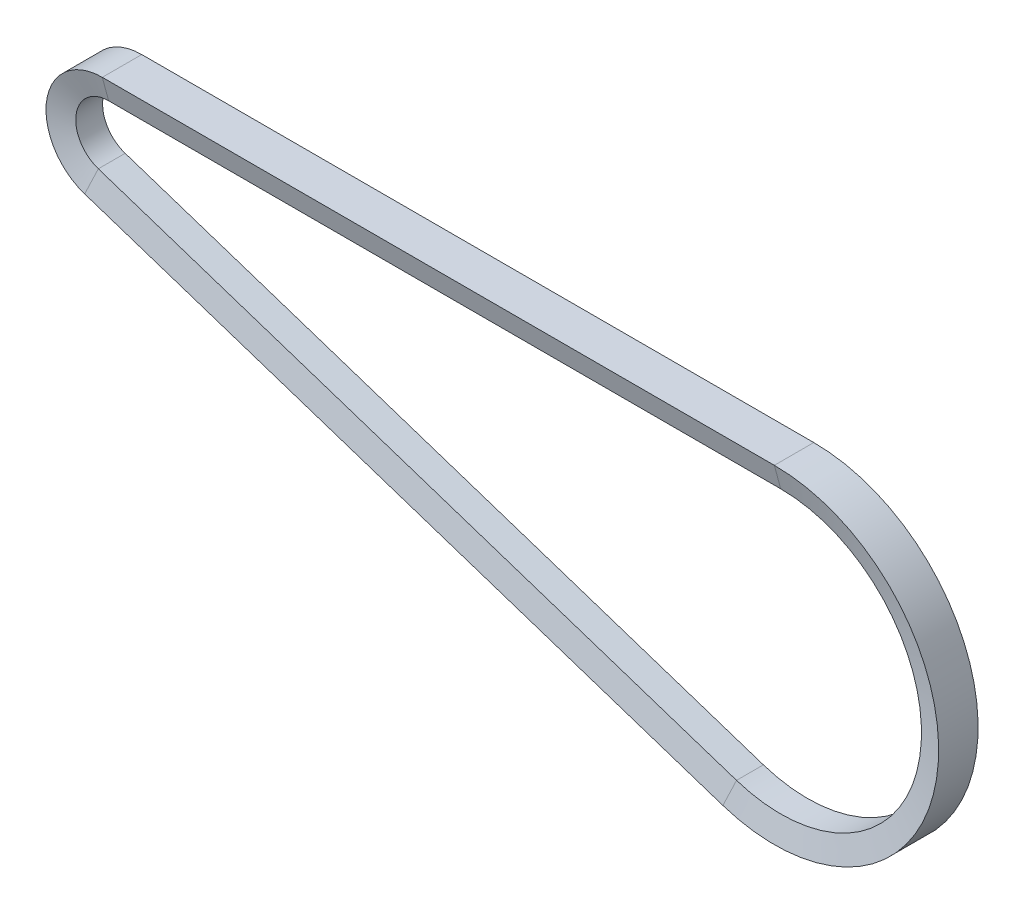
ISO-10303-21;
HEADER;
FILE_DESCRIPTION(('STEP AP214'),'2;1');
FILE_NAME('part.step','',(''),(''),'','','');
FILE_SCHEMA(('AUTOMOTIVE_DESIGN { 1 0 10303 214 1 1 1 1 }'));
ENDSEC;
DATA;
#1=APPLICATION_CONTEXT('core data for automotive mechanical design processes');
#2=APPLICATION_PROTOCOL_DEFINITION('international standard','automotive_design',2000,#1);
#3=PRODUCT_CONTEXT('',#1,'mechanical');
#4=PRODUCT('Part','Part','',(#3));
#5=PRODUCT_RELATED_PRODUCT_CATEGORY('part','',(#4));
#6=PRODUCT_DEFINITION_FORMATION('','',#4);
#7=PRODUCT_DEFINITION_CONTEXT('part definition',#1,'design');
#8=PRODUCT_DEFINITION('design','',#6,#7);
#9=PRODUCT_DEFINITION_SHAPE('','',#8);
#10=(LENGTH_UNIT() NAMED_UNIT(*) SI_UNIT(.MILLI.,.METRE.));
#11=(NAMED_UNIT(*) PLANE_ANGLE_UNIT() SI_UNIT($,.RADIAN.));
#12=(NAMED_UNIT(*) SI_UNIT($,.STERADIAN.) SOLID_ANGLE_UNIT());
#13=UNCERTAINTY_MEASURE_WITH_UNIT(LENGTH_MEASURE(1.E-05),#10,'distance_accuracy_value','');
#14=(GEOMETRIC_REPRESENTATION_CONTEXT(3) GLOBAL_UNCERTAINTY_ASSIGNED_CONTEXT((#13)) GLOBAL_UNIT_ASSIGNED_CONTEXT((#10,
#11,#12)) REPRESENTATION_CONTEXT('',''));
#15=CARTESIAN_POINT('',(0.,0.,0.));
#16=DIRECTION('',(0.,0.,1.));
#17=DIRECTION('',(1.,0.,0.));
#18=AXIS2_PLACEMENT_3D('',#15,#16,#17);
#19=CARTESIAN_POINT('',(0.,10.,-8.4));
#20=DIRECTION('',(0.,0.258819045102517,0.965925826289069));
#21=DIRECTION('',(0.,-0.965925826289069,0.258819045102517));
#22=AXIS2_PLACEMENT_3D('',#19,#20,#21);
#23=PLANE('',#22);
#24=DIRECTION('',(-1.,0.,0.));
#25=VECTOR('',#24,1.);
#26=CARTESIAN_POINT('',(0.,10.,-8.4));
#27=LINE('',#26,#25);
#28=CARTESIAN_POINT('',(145.664241345386,9.99999999999998,-8.4));
#29=VERTEX_POINT('',#28);
#30=CARTESIAN_POINT('',(-140.664241345386,10.,-8.4));
#31=VERTEX_POINT('',#30);
#32=EDGE_CURVE('E160',#29,#31,#27,.T.);
#33=ORIENTED_EDGE('',*,*,#32,.F.);
#34=DIRECTION('',(0.,0.965925826289069,-0.258819045102518));
#35=VECTOR('',#34,1.);
#36=CARTESIAN_POINT('',(145.664241345386,9.99999999999999,-8.4));
#37=LINE('',#36,#35);
#38=CARTESIAN_POINT('',(145.664241345386,0.,-5.72050807568881));
#39=VERTEX_POINT('',#38);
#40=EDGE_CURVE('E163',#39,#29,#37,.T.);
#41=ORIENTED_EDGE('',*,*,#40,.F.);
#42=DIRECTION('',(-1.,0.,0.));
#43=VECTOR('',#42,1.);
#44=CARTESIAN_POINT('',(0.,0.,-5.72050807568881));
#45=LINE('',#44,#43);
#46=CARTESIAN_POINT('',(-140.664241345386,0.,-5.72050807568881));
#47=VERTEX_POINT('',#46);
#48=EDGE_CURVE('E151',#39,#47,#45,.T.);
#49=ORIENTED_EDGE('',*,*,#48,.T.);
#50=DIRECTION('',(0.,0.965925826289069,-0.258819045102518));
#51=VECTOR('',#50,1.);
#52=CARTESIAN_POINT('',(-140.664241345386,10.,-8.4));
#53=LINE('',#52,#51);
#54=EDGE_CURVE('E154',#47,#31,#53,.T.);
#55=ORIENTED_EDGE('',*,*,#54,.T.);
#56=EDGE_LOOP('',(#33,#41,#49,#55));
#57=FACE_BOUND('',#56,.T.);
#58=ADVANCED_FACE('F41',(#57),#23,.F.);
#59=CARTESIAN_POINT('',(0.,10.,8.4));
#60=DIRECTION('',(0.,-1.,0.));
#61=DIRECTION('',(0.,0.,-1.));
#62=AXIS2_PLACEMENT_3D('',#59,#60,#61);
#63=PLANE('',#62);
#64=DIRECTION('',(-1.,0.,0.));
#65=VECTOR('',#64,1.);
#66=CARTESIAN_POINT('',(0.,10.,8.4));
#67=LINE('',#66,#65);
#68=CARTESIAN_POINT('',(145.664241345386,9.99999999999998,8.4));
#69=VERTEX_POINT('',#68);
#70=CARTESIAN_POINT('',(-140.664241345386,10.,8.4));
#71=VERTEX_POINT('',#70);
#72=EDGE_CURVE('E65',#69,#71,#67,.T.);
#73=ORIENTED_EDGE('',*,*,#72,.F.);
#74=DIRECTION('',(0.,0.,1.));
#75=VECTOR('',#74,1.);
#76=CARTESIAN_POINT('',(145.664241345386,9.99999999999998,8.4));
#77=LINE('',#76,#75);
#78=EDGE_CURVE('E181',#29,#69,#77,.T.);
#79=ORIENTED_EDGE('',*,*,#78,.F.);
#80=ORIENTED_EDGE('',*,*,#32,.T.);
#81=DIRECTION('',(0.,0.,1.));
#82=VECTOR('',#81,1.);
#83=CARTESIAN_POINT('',(-140.664241345386,10.,8.4));
#84=LINE('',#83,#82);
#85=EDGE_CURVE('E184',#31,#71,#84,.T.);
#86=ORIENTED_EDGE('',*,*,#85,.T.);
#87=EDGE_LOOP('',(#73,#79,#80,#86));
#88=FACE_BOUND('',#87,.T.);
#89=ADVANCED_FACE('F243',(#88),#63,.F.);
#90=CARTESIAN_POINT('',(0.,0.,5.72050807568881));
#91=DIRECTION('',(0.,0.258819045102518,-0.965925826289069));
#92=DIRECTION('',(0.,0.965925826289069,0.258819045102518));
#93=AXIS2_PLACEMENT_3D('',#90,#91,#92);
#94=PLANE('',#93);
#95=DIRECTION('',(-1.,0.,0.));
#96=VECTOR('',#95,1.);
#97=CARTESIAN_POINT('',(0.,0.,5.72050807568881));
#98=LINE('',#97,#96);
#99=CARTESIAN_POINT('',(145.664241345386,0.,5.72050807568881));
#100=VERTEX_POINT('',#99);
#101=CARTESIAN_POINT('',(-140.664241345386,0.,5.72050807568881));
#102=VERTEX_POINT('',#101);
#103=EDGE_CURVE('E56',#100,#102,#98,.T.);
#104=ORIENTED_EDGE('',*,*,#103,.F.);
#105=DIRECTION('',(0.,-0.965925826289069,-0.258819045102518));
#106=VECTOR('',#105,1.);
#107=CARTESIAN_POINT('',(145.664241345386,0.,5.72050807568881));
#108=LINE('',#107,#106);
#109=EDGE_CURVE('E199',#69,#100,#108,.T.);
#110=ORIENTED_EDGE('',*,*,#109,.F.);
#111=ORIENTED_EDGE('',*,*,#72,.T.);
#112=DIRECTION('',(0.,-0.965925826289069,-0.258819045102518));
#113=VECTOR('',#112,1.);
#114=CARTESIAN_POINT('',(-140.664241345386,0.,5.72050807568881));
#115=LINE('',#114,#113);
#116=EDGE_CURVE('E187',#71,#102,#115,.T.);
#117=ORIENTED_EDGE('',*,*,#116,.T.);
#118=EDGE_LOOP('',(#104,#110,#111,#117));
#119=FACE_BOUND('',#118,.T.);
#120=ADVANCED_FACE('F240',(#119),#94,.F.);
#121=CARTESIAN_POINT('',(0.,0.,-5.72050807568881));
#122=DIRECTION('',(0.,1.,0.));
#123=DIRECTION('',(0.,0.,1.));
#124=AXIS2_PLACEMENT_3D('',#121,#122,#123);
#125=PLANE('',#124);
#126=DIRECTION('',(0.,0.,-1.));
#127=VECTOR('',#126,1.);
#128=CARTESIAN_POINT('',(-140.664241345386,0.,-5.72050807568881));
#129=LINE('',#128,#127);
#130=EDGE_CURVE('E140',#102,#47,#129,.T.);
#131=ORIENTED_EDGE('',*,*,#130,.T.);
#132=ORIENTED_EDGE('',*,*,#48,.F.);
#133=DIRECTION('',(0.,0.,-1.));
#134=VECTOR('',#133,1.);
#135=CARTESIAN_POINT('',(145.664241345386,0.,-5.72050807568881));
#136=LINE('',#135,#134);
#137=EDGE_CURVE('E11',#100,#39,#136,.T.);
#138=ORIENTED_EDGE('',*,*,#137,.F.);
#139=ORIENTED_EDGE('',*,*,#103,.T.);
#140=EDGE_LOOP('',(#131,#132,#138,#139));
#141=FACE_BOUND('',#140,.T.);
#142=ADVANCED_FACE('F149',(#141),#125,.F.);
#143=CARTESIAN_POINT('',(-140.664241345386,-14.,-5.72050807568881));
#144=DIRECTION('',(0.,0.,-1.));
#145=DIRECTION('',(-1.,0.,0.));
#146=AXIS2_PLACEMENT_3D('',#143,#144,#145);
#147=CONICAL_SURFACE('',#146,14.,1.30899693899575);
#148=CARTESIAN_POINT('',(-140.664241345386,-14.,-8.4));
#149=DIRECTION('',(0.,0.,1.));
#150=DIRECTION('',(0.,1.,0.));
#151=AXIS2_PLACEMENT_3D('',#148,#149,#150);
#152=CIRCLE('',#151,24.);
#153=CARTESIAN_POINT('',(-148.181640748255,-36.7922948870392,-8.4));
#154=VERTEX_POINT('',#153);
#155=EDGE_CURVE('E157',#31,#154,#152,.T.);
#156=ORIENTED_EDGE('',*,*,#155,.F.);
#157=ORIENTED_EDGE('',*,*,#54,.F.);
#158=CARTESIAN_POINT('',(-140.664241345386,-14.,-5.72050807568881));
#159=DIRECTION('',(0.,0.,1.));
#160=DIRECTION('',(0.,1.,0.));
#161=AXIS2_PLACEMENT_3D('',#158,#159,#160);
#162=CIRCLE('',#161,14.);
#163=CARTESIAN_POINT('',(-145.049390997059,-27.2955053507729,-5.72050807568881));
#164=VERTEX_POINT('',#163);
#165=EDGE_CURVE('E136',#47,#164,#162,.T.);
#166=ORIENTED_EDGE('',*,*,#165,.T.);
#167=DIRECTION('',(-0.30255209290669,-0.917319427991146,-0.258819045102518));
#168=VECTOR('',#167,1.);
#169=CARTESIAN_POINT('',(-148.181640748255,-36.7922948870392,-8.4));
#170=LINE('',#169,#168);
#171=EDGE_CURVE('E146',#164,#154,#170,.T.);
#172=ORIENTED_EDGE('',*,*,#171,.T.);
#173=EDGE_LOOP('',(#156,#157,#166,#172));
#174=FACE_BOUND('',#173,.T.);
#175=ADVANCED_FACE('F155',(#174),#147,.F.);
#176=CARTESIAN_POINT('',(-140.664241345386,-14.,0.));
#177=DIRECTION('',(0.,0.,1.));
#178=DIRECTION('',(1.,0.,0.));
#179=AXIS2_PLACEMENT_3D('',#176,#177,#178);
#180=CYLINDRICAL_SURFACE('',#179,24.);
#181=CARTESIAN_POINT('',(-140.664241345386,-14.,8.4));
#182=DIRECTION('',(0.,0.,1.));
#183=DIRECTION('',(0.,1.,0.));
#184=AXIS2_PLACEMENT_3D('',#181,#182,#183);
#185=CIRCLE('',#184,24.);
#186=CARTESIAN_POINT('',(-148.181640748255,-36.7922948870392,8.4));
#187=VERTEX_POINT('',#186);
#188=EDGE_CURVE('E190',#71,#187,#185,.T.);
#189=ORIENTED_EDGE('',*,*,#188,.F.);
#190=ORIENTED_EDGE('',*,*,#85,.F.);
#191=ORIENTED_EDGE('',*,*,#155,.T.);
#192=DIRECTION('',(0.,0.,1.));
#193=VECTOR('',#192,1.);
#194=CARTESIAN_POINT('',(-148.181640748255,-36.7922948870392,8.4));
#195=LINE('',#194,#193);
#196=EDGE_CURVE('E169',#154,#187,#195,.T.);
#197=ORIENTED_EDGE('',*,*,#196,.T.);
#198=EDGE_LOOP('',(#189,#190,#191,#197));
#199=FACE_BOUND('',#198,.T.);
#200=ADVANCED_FACE('F245',(#199),#180,.T.);
#201=CARTESIAN_POINT('',(-140.664241345386,-14.,8.4));
#202=DIRECTION('',(0.,0.,1.));
#203=DIRECTION('',(1.,0.,0.));
#204=AXIS2_PLACEMENT_3D('',#201,#202,#203);
#205=CONICAL_SURFACE('',#204,24.,1.30899693899575);
#206=CARTESIAN_POINT('',(-140.664241345386,-14.,5.72050807568881));
#207=DIRECTION('',(0.,0.,1.));
#208=DIRECTION('',(0.,1.,0.));
#209=AXIS2_PLACEMENT_3D('',#206,#207,#208);
#210=CIRCLE('',#209,14.);
#211=CARTESIAN_POINT('',(-145.049390997059,-27.2955053507729,5.72050807568881));
#212=VERTEX_POINT('',#211);
#213=EDGE_CURVE('E204',#102,#212,#210,.T.);
#214=ORIENTED_EDGE('',*,*,#213,.F.);
#215=ORIENTED_EDGE('',*,*,#116,.F.);
#216=ORIENTED_EDGE('',*,*,#188,.T.);
#217=DIRECTION('',(0.302552092906689,0.917319427991146,-0.258819045102518));
#218=VECTOR('',#217,1.);
#219=CARTESIAN_POINT('',(-145.049390997059,-27.2955053507729,5.72050807568881));
#220=LINE('',#219,#218);
#221=EDGE_CURVE('E193',#187,#212,#220,.T.);
#222=ORIENTED_EDGE('',*,*,#221,.T.);
#223=EDGE_LOOP('',(#214,#215,#216,#222));
#224=FACE_BOUND('',#223,.T.);
#225=ADVANCED_FACE('F228',(#224),#205,.F.);
#226=CARTESIAN_POINT('',(-140.664241345386,-14.,0.));
#227=DIRECTION('',(0.,0.,1.));
#228=DIRECTION('',(1.,0.,0.));
#229=AXIS2_PLACEMENT_3D('',#226,#227,#228);
#230=CYLINDRICAL_SURFACE('',#229,14.);
#231=DIRECTION('',(0.,0.,-1.));
#232=VECTOR('',#231,1.);
#233=CARTESIAN_POINT('',(-145.049390997059,-27.2955053507729,-5.72050807568881));
#234=LINE('',#233,#232);
#235=EDGE_CURVE('E142',#212,#164,#234,.T.);
#236=ORIENTED_EDGE('',*,*,#235,.T.);
#237=ORIENTED_EDGE('',*,*,#165,.F.);
#238=ORIENTED_EDGE('',*,*,#130,.F.);
#239=ORIENTED_EDGE('',*,*,#213,.T.);
#240=EDGE_LOOP('',(#236,#237,#238,#239));
#241=FACE_BOUND('',#240,.T.);
#242=ADVANCED_FACE('F138',(#241),#230,.F.);
#243=CARTESIAN_POINT('',(-148.181640748255,-36.7922948870392,-8.4));
#244=DIRECTION('',(-0.0810685889626922,-0.245794999931604,0.965925826289069));
#245=DIRECTION('',(0.,-0.969115646173648,-0.246606699709136));
#246=AXIS2_PLACEMENT_3D('',#243,#244,#245);
#247=PLANE('',#246);
#248=DIRECTION('',(0.949678953626635,-0.313224975119513,0.));
#249=VECTOR('',#248,1.);
#250=CARTESIAN_POINT('',(-148.181640748255,-36.7922948870392,-8.4));
#251=LINE('',#250,#249);
#252=CARTESIAN_POINT('',(123.73849308702,-126.477526753864,-8.4));
#253=VERTEX_POINT('',#252);
#254=EDGE_CURVE('E124',#154,#253,#251,.T.);
#255=ORIENTED_EDGE('',*,*,#254,.F.);
#256=ORIENTED_EDGE('',*,*,#171,.F.);
#257=DIRECTION('',(0.949678953626635,-0.313224975119513,0.));
#258=VECTOR('',#257,1.);
#259=CARTESIAN_POINT('',(-145.049390997059,-27.2955053507729,-5.72050807568881));
#260=LINE('',#259,#258);
#261=CARTESIAN_POINT('',(126.870742838216,-116.980737217598,-5.72050807568881));
#262=VERTEX_POINT('',#261);
#263=EDGE_CURVE('E173',#164,#262,#260,.T.);
#264=ORIENTED_EDGE('',*,*,#263,.T.);
#265=DIRECTION('',(-0.302552092906689,-0.917319427991146,-0.258819045102518));
#266=VECTOR('',#265,1.);
#267=CARTESIAN_POINT('',(123.73849308702,-126.477526753864,-8.4));
#268=LINE('',#267,#266);
#269=EDGE_CURVE('E171',#262,#253,#268,.T.);
#270=ORIENTED_EDGE('',*,*,#269,.T.);
#271=EDGE_LOOP('',(#255,#256,#264,#270));
#272=FACE_BOUND('',#271,.T.);
#273=ADVANCED_FACE('F218',(#272),#247,.F.);
#274=CARTESIAN_POINT('',(-148.181640748255,-36.7922948870392,8.4));
#275=DIRECTION('',(0.313224975119513,0.949678953626635,0.));
#276=DIRECTION('',(-0.949678953626635,0.313224975119513,0.));
#277=AXIS2_PLACEMENT_3D('',#274,#275,#276);
#278=PLANE('',#277);
#279=DIRECTION('',(0.949678953626635,-0.313224975119513,0.));
#280=VECTOR('',#279,1.);
#281=CARTESIAN_POINT('',(-148.181640748255,-36.7922948870392,8.4));
#282=LINE('',#281,#280);
#283=CARTESIAN_POINT('',(123.73849308702,-126.477526753864,8.4));
#284=VERTEX_POINT('',#283);
#285=EDGE_CURVE('E117',#187,#284,#282,.T.);
#286=ORIENTED_EDGE('',*,*,#285,.F.);
#287=ORIENTED_EDGE('',*,*,#196,.F.);
#288=ORIENTED_EDGE('',*,*,#254,.T.);
#289=DIRECTION('',(0.,0.,1.));
#290=VECTOR('',#289,1.);
#291=CARTESIAN_POINT('',(123.73849308702,-126.477526753864,8.4));
#292=LINE('',#291,#290);
#293=EDGE_CURVE('E175',#253,#284,#292,.T.);
#294=ORIENTED_EDGE('',*,*,#293,.T.);
#295=EDGE_LOOP('',(#286,#287,#288,#294));
#296=FACE_BOUND('',#295,.T.);
#297=ADVANCED_FACE('F220',(#296),#278,.F.);
#298=CARTESIAN_POINT('',(-145.049390997059,-27.2955053507729,5.72050807568881));
#299=DIRECTION('',(-0.0810685889626925,-0.245794999931604,-0.965925826289069));
#300=DIRECTION('',(0.,0.969115646173648,-0.246606699709137));
#301=AXIS2_PLACEMENT_3D('',#298,#299,#300);
#302=PLANE('',#301);
#303=DIRECTION('',(0.949678953626635,-0.313224975119513,0.));
#304=VECTOR('',#303,1.);
#305=CARTESIAN_POINT('',(-145.049390997059,-27.2955053507729,5.72050807568881));
#306=LINE('',#305,#304);
#307=CARTESIAN_POINT('',(126.870742838216,-116.980737217598,5.72050807568881));
#308=VERTEX_POINT('',#307);
#309=EDGE_CURVE('E208',#212,#308,#306,.T.);
#310=ORIENTED_EDGE('',*,*,#309,.F.);
#311=ORIENTED_EDGE('',*,*,#221,.F.);
#312=ORIENTED_EDGE('',*,*,#285,.T.);
#313=DIRECTION('',(0.302552092906689,0.917319427991146,-0.258819045102518));
#314=VECTOR('',#313,1.);
#315=CARTESIAN_POINT('',(126.870742838215,-116.980737217598,5.72050807568881));
#316=LINE('',#315,#314);
#317=EDGE_CURVE('E196',#284,#308,#316,.T.);
#318=ORIENTED_EDGE('',*,*,#317,.T.);
#319=EDGE_LOOP('',(#310,#311,#312,#318));
#320=FACE_BOUND('',#319,.T.);
#321=ADVANCED_FACE('F226',(#320),#302,.F.);
#322=CARTESIAN_POINT('',(-145.049390997059,-27.2955053507729,-5.72050807568881));
#323=DIRECTION('',(-0.313224975119513,-0.949678953626635,0.));
#324=DIRECTION('',(0.949678953626635,-0.313224975119513,0.));
#325=AXIS2_PLACEMENT_3D('',#322,#323,#324);
#326=PLANE('',#325);
#327=DIRECTION('',(0.,0.,-1.));
#328=VECTOR('',#327,1.);
#329=CARTESIAN_POINT('',(126.870742838215,-116.980737217598,-5.72050807568881));
#330=LINE('',#329,#328);
#331=EDGE_CURVE('E183',#308,#262,#330,.T.);
#332=ORIENTED_EDGE('',*,*,#331,.T.);
#333=ORIENTED_EDGE('',*,*,#263,.F.);
#334=ORIENTED_EDGE('',*,*,#235,.F.);
#335=ORIENTED_EDGE('',*,*,#309,.T.);
#336=EDGE_LOOP('',(#332,#333,#334,#335));
#337=FACE_BOUND('',#336,.T.);
#338=ADVANCED_FACE('F215',(#337),#326,.F.);
#339=CARTESIAN_POINT('',(145.664241345386,-60.,-5.72050807568881));
#340=DIRECTION('',(0.,0.,-1.));
#341=DIRECTION('',(-1.,0.,0.));
#342=AXIS2_PLACEMENT_3D('',#339,#340,#341);
#343=CONICAL_SURFACE('',#342,60.,1.30899693899575);
#344=CARTESIAN_POINT('',(145.664241345386,-60.,-8.4));
#345=DIRECTION('',(0.,0.,1.));
#346=DIRECTION('',(-0.313224975119513,-0.949678953626635,0.));
#347=AXIS2_PLACEMENT_3D('',#344,#345,#346);
#348=CIRCLE('',#347,70.);
#349=EDGE_CURVE('E104',#253,#29,#348,.T.);
#350=ORIENTED_EDGE('',*,*,#349,.F.);
#351=ORIENTED_EDGE('',*,*,#269,.F.);
#352=CARTESIAN_POINT('',(145.664241345386,-60.,-5.72050807568881));
#353=DIRECTION('',(0.,0.,1.));
#354=DIRECTION('',(-0.313224975119513,-0.949678953626635,0.));
#355=AXIS2_PLACEMENT_3D('',#352,#353,#354);
#356=CIRCLE('',#355,60.);
#357=EDGE_CURVE('E179',#262,#39,#356,.T.);
#358=ORIENTED_EDGE('',*,*,#357,.T.);
#359=ORIENTED_EDGE('',*,*,#40,.T.);
#360=EDGE_LOOP('',(#350,#351,#358,#359));
#361=FACE_BOUND('',#360,.T.);
#362=ADVANCED_FACE('F217',(#361),#343,.F.);
#363=CARTESIAN_POINT('',(145.664241345386,-60.,0.));
#364=DIRECTION('',(0.,0.,1.));
#365=DIRECTION('',(1.,0.,0.));
#366=AXIS2_PLACEMENT_3D('',#363,#364,#365);
#367=CYLINDRICAL_SURFACE('',#366,70.);
#368=CARTESIAN_POINT('',(145.664241345386,-60.,8.4));
#369=DIRECTION('',(0.,0.,1.));
#370=DIRECTION('',(-0.313224975119513,-0.949678953626635,0.));
#371=AXIS2_PLACEMENT_3D('',#368,#369,#370);
#372=CIRCLE('',#371,70.);
#373=EDGE_CURVE('E97',#284,#69,#372,.T.);
#374=ORIENTED_EDGE('',*,*,#373,.F.);
#375=ORIENTED_EDGE('',*,*,#293,.F.);
#376=ORIENTED_EDGE('',*,*,#349,.T.);
#377=ORIENTED_EDGE('',*,*,#78,.T.);
#378=EDGE_LOOP('',(#374,#375,#376,#377));
#379=FACE_BOUND('',#378,.T.);
#380=ADVANCED_FACE('F238',(#379),#367,.T.);
#381=CARTESIAN_POINT('',(145.664241345386,-60.,8.4));
#382=DIRECTION('',(0.,0.,1.));
#383=DIRECTION('',(1.,0.,0.));
#384=AXIS2_PLACEMENT_3D('',#381,#382,#383);
#385=CONICAL_SURFACE('',#384,70.,1.30899693899575);
#386=CARTESIAN_POINT('',(145.664241345386,-60.,5.72050807568881));
#387=DIRECTION('',(0.,0.,1.));
#388=DIRECTION('',(-0.313224975119513,-0.949678953626635,0.));
#389=AXIS2_PLACEMENT_3D('',#386,#387,#388);
#390=CIRCLE('',#389,60.);
#391=EDGE_CURVE('E49',#308,#100,#390,.T.);
#392=ORIENTED_EDGE('',*,*,#391,.F.);
#393=ORIENTED_EDGE('',*,*,#317,.F.);
#394=ORIENTED_EDGE('',*,*,#373,.T.);
#395=ORIENTED_EDGE('',*,*,#109,.T.);
#396=EDGE_LOOP('',(#392,#393,#394,#395));
#397=FACE_BOUND('',#396,.T.);
#398=ADVANCED_FACE('F233',(#397),#385,.F.);
#399=CARTESIAN_POINT('',(145.664241345386,-60.,0.));
#400=DIRECTION('',(0.,0.,1.));
#401=DIRECTION('',(1.,0.,0.));
#402=AXIS2_PLACEMENT_3D('',#399,#400,#401);
#403=CYLINDRICAL_SURFACE('',#402,60.);
#404=ORIENTED_EDGE('',*,*,#137,.T.);
#405=ORIENTED_EDGE('',*,*,#357,.F.);
#406=ORIENTED_EDGE('',*,*,#331,.F.);
#407=ORIENTED_EDGE('',*,*,#391,.T.);
#408=EDGE_LOOP('',(#404,#405,#406,#407));
#409=FACE_BOUND('',#408,.T.);
#410=ADVANCED_FACE('F43',(#409),#403,.F.);
#411=CLOSED_SHELL('',(#58,#89,#120,#142,#175,#200,#225,#242,#273,#297,#321,#338,#362,#380,#398,#410));
#412=MANIFOLD_SOLID_BREP('B2',#411);
#413=ADVANCED_BREP_SHAPE_REPRESENTATION('',(#18,#412),#14);
#414=SHAPE_DEFINITION_REPRESENTATION(#9,#413);
ENDSEC;
END-ISO-10303-21;
